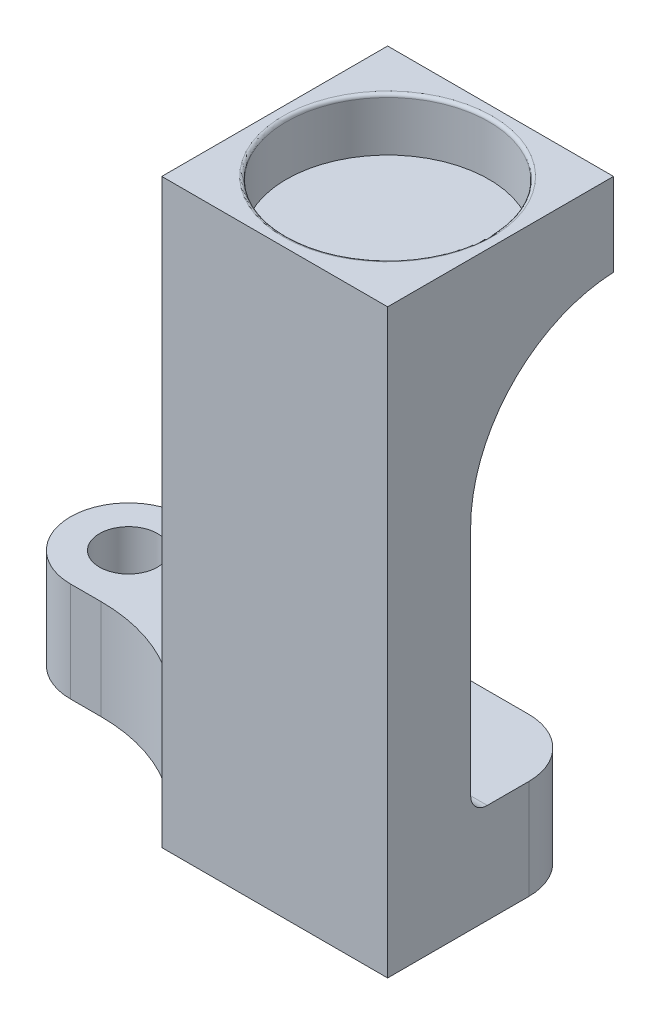
ISO-10303-21;
HEADER;
FILE_DESCRIPTION(('STEP AP214'),'2;1');
FILE_NAME('part.step','',(''),(''),'','','');
FILE_SCHEMA(('AUTOMOTIVE_DESIGN { 1 0 10303 214 1 1 1 1 }'));
ENDSEC;
DATA;
#1=APPLICATION_CONTEXT('core data for automotive mechanical design processes');
#2=APPLICATION_PROTOCOL_DEFINITION('international standard','automotive_design',2000,#1);
#3=PRODUCT_CONTEXT('',#1,'mechanical');
#4=PRODUCT('Part','Part','',(#3));
#5=PRODUCT_RELATED_PRODUCT_CATEGORY('part','',(#4));
#6=PRODUCT_DEFINITION_FORMATION('','',#4);
#7=PRODUCT_DEFINITION_CONTEXT('part definition',#1,'design');
#8=PRODUCT_DEFINITION('design','',#6,#7);
#9=PRODUCT_DEFINITION_SHAPE('','',#8);
#10=(LENGTH_UNIT() NAMED_UNIT(*) SI_UNIT(.MILLI.,.METRE.));
#11=(NAMED_UNIT(*) PLANE_ANGLE_UNIT() SI_UNIT($,.RADIAN.));
#12=(NAMED_UNIT(*) SI_UNIT($,.STERADIAN.) SOLID_ANGLE_UNIT());
#13=UNCERTAINTY_MEASURE_WITH_UNIT(LENGTH_MEASURE(1.E-05),#10,'distance_accuracy_value','');
#14=(GEOMETRIC_REPRESENTATION_CONTEXT(3) GLOBAL_UNCERTAINTY_ASSIGNED_CONTEXT((#13)) GLOBAL_UNIT_ASSIGNED_CONTEXT((#10,
#11,#12)) REPRESENTATION_CONTEXT('',''));
#15=CARTESIAN_POINT('',(0.,0.,0.));
#16=DIRECTION('',(0.,0.,1.));
#17=DIRECTION('',(1.,0.,0.));
#18=AXIS2_PLACEMENT_3D('',#15,#16,#17);
#19=CARTESIAN_POINT('',(-6.8,-30.,1.8));
#20=DIRECTION('',(0.,0.,1.));
#21=DIRECTION('',(1.,0.,0.));
#22=AXIS2_PLACEMENT_3D('',#19,#20,#21);
#23=PLANE('',#22);
#24=DIRECTION('',(0.,1.,0.));
#25=VECTOR('',#24,1.);
#26=CARTESIAN_POINT('',(6.8,-30.,1.8));
#27=LINE('',#26,#25);
#28=CARTESIAN_POINT('',(6.8,-23.,1.8));
#29=VERTEX_POINT('',#28);
#30=CARTESIAN_POINT('',(6.8,-8.99110671719561,1.8));
#31=VERTEX_POINT('',#30);
#32=EDGE_CURVE('E162',#29,#31,#27,.T.);
#33=ORIENTED_EDGE('',*,*,#32,.F.);
#34=DIRECTION('',(1.,0.,0.));
#35=VECTOR('',#34,1.);
#36=CARTESIAN_POINT('',(-6.79999999999999,-23.,1.8));
#37=LINE('',#36,#35);
#38=CARTESIAN_POINT('',(-6.8,-23.,1.8));
#39=VERTEX_POINT('',#38);
#40=EDGE_CURVE('E242',#29,#39,#37,.F.);
#41=ORIENTED_EDGE('',*,*,#40,.T.);
#42=DIRECTION('',(0.,1.,0.));
#43=VECTOR('',#42,1.);
#44=CARTESIAN_POINT('',(-6.8,-30.,1.8));
#45=LINE('',#44,#43);
#46=CARTESIAN_POINT('',(-6.8,-8.99110671719561,1.8));
#47=VERTEX_POINT('',#46);
#48=EDGE_CURVE('E164',#39,#47,#45,.T.);
#49=ORIENTED_EDGE('',*,*,#48,.T.);
#50=DIRECTION('',(1.,0.,0.));
#51=VECTOR('',#50,1.);
#52=CARTESIAN_POINT('',(-6.8,-8.99110671719561,1.8));
#53=LINE('',#52,#51);
#54=EDGE_CURVE('E194',#47,#31,#53,.T.);
#55=ORIENTED_EDGE('',*,*,#54,.T.);
#56=EDGE_LOOP('',(#33,#41,#49,#55));
#57=FACE_BOUND('',#56,.T.);
#58=ADVANCED_FACE('F39',(#57),#23,.F.);
#59=CARTESIAN_POINT('',(6.8,5.,-6.8));
#60=DIRECTION('',(-1.,0.,0.));
#61=DIRECTION('',(0.,0.,1.));
#62=AXIS2_PLACEMENT_3D('',#59,#60,#61);
#63=PLANE('',#62);
#64=DIRECTION('',(0.,0.,1.));
#65=VECTOR('',#64,1.);
#66=CARTESIAN_POINT('',(6.8,-30.,6.8));
#67=LINE('',#66,#65);
#68=CARTESIAN_POINT('',(6.8,-30.,-1.7));
#69=VERTEX_POINT('',#68);
#70=CARTESIAN_POINT('',(6.8,-30.,6.8));
#71=VERTEX_POINT('',#70);
#72=EDGE_CURVE('E135',#69,#71,#67,.T.);
#73=ORIENTED_EDGE('',*,*,#72,.F.);
#74=DIRECTION('',(0.,-1.,0.));
#75=VECTOR('',#74,1.);
#76=CARTESIAN_POINT('',(6.8,5.,-1.7));
#77=LINE('',#76,#75);
#78=CARTESIAN_POINT('',(6.8,-24.,-1.7));
#79=VERTEX_POINT('',#78);
#80=EDGE_CURVE('E229',#69,#79,#77,.F.);
#81=ORIENTED_EDGE('',*,*,#80,.T.);
#82=DIRECTION('',(0.,0.,1.));
#83=VECTOR('',#82,1.);
#84=CARTESIAN_POINT('',(6.8,-24.,-5.2));
#85=LINE('',#84,#83);
#86=CARTESIAN_POINT('',(6.8,-24.,0.799999999999997));
#87=VERTEX_POINT('',#86);
#88=EDGE_CURVE('E145',#79,#87,#85,.T.);
#89=ORIENTED_EDGE('',*,*,#88,.T.);
#90=CARTESIAN_POINT('',(6.8,-23.,0.799999999999997));
#91=DIRECTION('',(-1.,0.,0.));
#92=DIRECTION('',(0.,0.,1.));
#93=AXIS2_PLACEMENT_3D('',#90,#91,#92);
#94=CIRCLE('',#93,1.);
#95=EDGE_CURVE('E11',#87,#29,#94,.T.);
#96=ORIENTED_EDGE('',*,*,#95,.T.);
#97=ORIENTED_EDGE('',*,*,#32,.T.);
#98=CARTESIAN_POINT('',(6.8,-8.99110671719561,-7.2));
#99=DIRECTION('',(-1.,0.,0.));
#100=DIRECTION('',(0.,0.,1.));
#101=AXIS2_PLACEMENT_3D('',#98,#99,#100);
#102=CIRCLE('',#101,9.);
#103=CARTESIAN_POINT('',(6.8,0.,-6.8));
#104=VERTEX_POINT('',#103);
#105=EDGE_CURVE('E197',#31,#104,#102,.T.);
#106=ORIENTED_EDGE('',*,*,#105,.T.);
#107=DIRECTION('',(0.,-1.,0.));
#108=VECTOR('',#107,1.);
#109=CARTESIAN_POINT('',(6.8,5.,-6.8));
#110=LINE('',#109,#108);
#111=CARTESIAN_POINT('',(6.8,5.,-6.8));
#112=VERTEX_POINT('',#111);
#113=EDGE_CURVE('E185',#112,#104,#110,.T.);
#114=ORIENTED_EDGE('',*,*,#113,.F.);
#115=DIRECTION('',(0.,0.,-1.));
#116=VECTOR('',#115,1.);
#117=CARTESIAN_POINT('',(6.8,5.,-6.8));
#118=LINE('',#117,#116);
#119=CARTESIAN_POINT('',(6.8,5.,6.8));
#120=VERTEX_POINT('',#119);
#121=EDGE_CURVE('E153',#120,#112,#118,.T.);
#122=ORIENTED_EDGE('',*,*,#121,.F.);
#123=DIRECTION('',(0.,-1.,0.));
#124=VECTOR('',#123,1.);
#125=CARTESIAN_POINT('',(6.8,5.,6.8));
#126=LINE('',#125,#124);
#127=EDGE_CURVE('E149',#120,#71,#126,.T.);
#128=ORIENTED_EDGE('',*,*,#127,.T.);
#129=EDGE_LOOP('',(#73,#81,#89,#96,#97,#106,#114,#122,#128));
#130=FACE_BOUND('',#129,.T.);
#131=ADVANCED_FACE('F150',(#130),#63,.F.);
#132=CARTESIAN_POINT('',(-6.8,5.,-6.8));
#133=DIRECTION('',(0.,0.,1.));
#134=DIRECTION('',(1.,0.,0.));
#135=AXIS2_PLACEMENT_3D('',#132,#133,#134);
#136=PLANE('',#135);
#137=DIRECTION('',(-1.,0.,0.));
#138=VECTOR('',#137,1.);
#139=CARTESIAN_POINT('',(-6.8,0.,-6.8));
#140=LINE('',#139,#138);
#141=CARTESIAN_POINT('',(-6.8,0.,-6.8));
#142=VERTEX_POINT('',#141);
#143=EDGE_CURVE('E172',#104,#142,#140,.T.);
#144=ORIENTED_EDGE('',*,*,#143,.T.);
#145=DIRECTION('',(0.,-1.,0.));
#146=VECTOR('',#145,1.);
#147=CARTESIAN_POINT('',(-6.8,5.,-6.8));
#148=LINE('',#147,#146);
#149=CARTESIAN_POINT('',(-6.8,5.,-6.8));
#150=VERTEX_POINT('',#149);
#151=EDGE_CURVE('E182',#150,#142,#148,.T.);
#152=ORIENTED_EDGE('',*,*,#151,.F.);
#153=DIRECTION('',(-1.,0.,0.));
#154=VECTOR('',#153,1.);
#155=CARTESIAN_POINT('',(-6.8,5.,-6.8));
#156=LINE('',#155,#154);
#157=EDGE_CURVE('E174',#112,#150,#156,.T.);
#158=ORIENTED_EDGE('',*,*,#157,.F.);
#159=ORIENTED_EDGE('',*,*,#113,.T.);
#160=EDGE_LOOP('',(#144,#152,#158,#159));
#161=FACE_BOUND('',#160,.T.);
#162=ADVANCED_FACE('F276',(#161),#136,.F.);
#163=CARTESIAN_POINT('',(-6.8,5.,-6.8));
#164=DIRECTION('',(1.,0.,0.));
#165=DIRECTION('',(0.,0.,-1.));
#166=AXIS2_PLACEMENT_3D('',#163,#164,#165);
#167=PLANE('',#166);
#168=ORIENTED_EDGE('',*,*,#48,.F.);
#169=DIRECTION('',(0.,0.,1.));
#170=VECTOR('',#169,1.);
#171=CARTESIAN_POINT('',(-6.8,-23.,6.8));
#172=LINE('',#171,#170);
#173=CARTESIAN_POINT('',(-6.8,-23.,6.8));
#174=VERTEX_POINT('',#173);
#175=EDGE_CURVE('E231',#39,#174,#172,.T.);
#176=ORIENTED_EDGE('',*,*,#175,.T.);
#177=DIRECTION('',(0.,-1.,0.));
#178=VECTOR('',#177,1.);
#179=CARTESIAN_POINT('',(-6.8,5.,6.8));
#180=LINE('',#179,#178);
#181=CARTESIAN_POINT('',(-6.8,5.,6.8));
#182=VERTEX_POINT('',#181);
#183=EDGE_CURVE('E180',#182,#174,#180,.T.);
#184=ORIENTED_EDGE('',*,*,#183,.F.);
#185=DIRECTION('',(0.,0.,1.));
#186=VECTOR('',#185,1.);
#187=CARTESIAN_POINT('',(-6.8,5.,-6.8));
#188=LINE('',#187,#186);
#189=EDGE_CURVE('E176',#150,#182,#188,.T.);
#190=ORIENTED_EDGE('',*,*,#189,.F.);
#191=ORIENTED_EDGE('',*,*,#151,.T.);
#192=CARTESIAN_POINT('',(-6.8,-8.99110671719561,-7.2));
#193=DIRECTION('',(1.,0.,0.));
#194=DIRECTION('',(0.,0.,-1.));
#195=AXIS2_PLACEMENT_3D('',#192,#193,#194);
#196=CIRCLE('',#195,9.);
#197=EDGE_CURVE('E199',#142,#47,#196,.T.);
#198=ORIENTED_EDGE('',*,*,#197,.T.);
#199=EDGE_LOOP('',(#168,#176,#184,#190,#191,#198));
#200=FACE_BOUND('',#199,.T.);
#201=ADVANCED_FACE('F295',(#200),#167,.F.);
#202=CARTESIAN_POINT('',(-6.8,5.,6.8));
#203=DIRECTION('',(0.,0.,-1.));
#204=DIRECTION('',(-1.,0.,0.));
#205=AXIS2_PLACEMENT_3D('',#202,#203,#204);
#206=PLANE('',#205);
#207=ORIENTED_EDGE('',*,*,#183,.T.);
#208=CARTESIAN_POINT('',(-6.8,-30.,6.8));
#209=VERTEX_POINT('',#208);
#210=EDGE_CURVE('E156',#174,#209,#180,.T.);
#211=ORIENTED_EDGE('',*,*,#210,.T.);
#212=DIRECTION('',(-1.,0.,0.));
#213=VECTOR('',#212,1.);
#214=CARTESIAN_POINT('',(-6.8,-30.,6.8));
#215=LINE('',#214,#213);
#216=EDGE_CURVE('E140',#71,#209,#215,.T.);
#217=ORIENTED_EDGE('',*,*,#216,.F.);
#218=ORIENTED_EDGE('',*,*,#127,.F.);
#219=DIRECTION('',(1.,0.,0.));
#220=VECTOR('',#219,1.);
#221=CARTESIAN_POINT('',(-6.8,5.,6.8));
#222=LINE('',#221,#220);
#223=EDGE_CURVE('E157',#182,#120,#222,.T.);
#224=ORIENTED_EDGE('',*,*,#223,.F.);
#225=EDGE_LOOP('',(#207,#211,#217,#218,#224));
#226=FACE_BOUND('',#225,.T.);
#227=ADVANCED_FACE('F160',(#226),#206,.F.);
#228=CARTESIAN_POINT('',(0.,5.,0.));
#229=DIRECTION('',(0.,1.,0.));
#230=DIRECTION('',(0.,0.,1.));
#231=AXIS2_PLACEMENT_3D('',#228,#229,#230);
#232=PLANE('',#231);
#233=CARTESIAN_POINT('',(0.,5.,0.));
#234=DIRECTION('',(0.,1.,0.));
#235=DIRECTION('',(0.,0.,1.));
#236=AXIS2_PLACEMENT_3D('',#233,#234,#235);
#237=CIRCLE('',#236,6.3);
#238=CARTESIAN_POINT('',(0.,5.,6.3));
#239=VERTEX_POINT('',#238);
#240=EDGE_CURVE('E191',#239,#239,#237,.F.);
#241=ORIENTED_EDGE('',*,*,#240,.T.);
#242=EDGE_LOOP('',(#241));
#243=FACE_BOUND('',#242,.T.);
#244=ORIENTED_EDGE('',*,*,#121,.T.);
#245=ORIENTED_EDGE('',*,*,#157,.T.);
#246=ORIENTED_EDGE('',*,*,#189,.T.);
#247=ORIENTED_EDGE('',*,*,#223,.T.);
#248=EDGE_LOOP('',(#244,#245,#246,#247));
#249=FACE_BOUND('',#248,.T.);
#250=ADVANCED_FACE('F288',(#243,#249),#232,.T.);
#251=CARTESIAN_POINT('',(0.,1.8,0.));
#252=DIRECTION('',(0.,1.,0.));
#253=DIRECTION('',(0.,0.,1.));
#254=AXIS2_PLACEMENT_3D('',#251,#252,#253);
#255=CYLINDRICAL_SURFACE('',#254,6.1);
#256=CARTESIAN_POINT('',(0.,4.8,0.));
#257=DIRECTION('',(0.,1.,0.));
#258=DIRECTION('',(0.,0.,1.));
#259=AXIS2_PLACEMENT_3D('',#256,#257,#258);
#260=CIRCLE('',#259,6.1);
#261=CARTESIAN_POINT('',(0.,4.8,6.1));
#262=VERTEX_POINT('',#261);
#263=EDGE_CURVE('E188',#262,#262,#260,.T.);
#264=ORIENTED_EDGE('',*,*,#263,.T.);
#265=EDGE_LOOP('',(#264));
#266=FACE_BOUND('',#265,.T.);
#267=CARTESIAN_POINT('',(0.,1.8,0.));
#268=DIRECTION('',(0.,1.,0.));
#269=DIRECTION('',(0.,0.,1.));
#270=AXIS2_PLACEMENT_3D('',#267,#268,#269);
#271=CIRCLE('',#270,6.1);
#272=CARTESIAN_POINT('',(0.,1.8,6.1));
#273=VERTEX_POINT('',#272);
#274=EDGE_CURVE('E169',#273,#273,#271,.T.);
#275=ORIENTED_EDGE('',*,*,#274,.F.);
#276=EDGE_LOOP('',(#275));
#277=FACE_BOUND('',#276,.T.);
#278=ADVANCED_FACE('F284',(#266,#277),#255,.F.);
#279=CARTESIAN_POINT('',(0.,1.8,0.));
#280=DIRECTION('',(0.,1.,0.));
#281=DIRECTION('',(0.,0.,1.));
#282=AXIS2_PLACEMENT_3D('',#279,#280,#281);
#283=PLANE('',#282);
#284=ORIENTED_EDGE('',*,*,#274,.T.);
#285=EDGE_LOOP('',(#284));
#286=FACE_BOUND('',#285,.T.);
#287=ADVANCED_FACE('F281',(#286),#283,.T.);
#288=CARTESIAN_POINT('',(0.,-30.,0.));
#289=DIRECTION('',(0.,-1.,0.));
#290=DIRECTION('',(0.,0.,-1.));
#291=AXIS2_PLACEMENT_3D('',#288,#289,#290);
#292=PLANE('',#291);
#293=CARTESIAN_POINT('',(-10.3,-30.,-1.7));
#294=DIRECTION('',(0.,1.,0.));
#295=DIRECTION('',(0.,0.,1.));
#296=AXIS2_PLACEMENT_3D('',#293,#294,#295);
#297=CIRCLE('',#296,1.75);
#298=CARTESIAN_POINT('',(-10.3,-30.,0.0499999999999956));
#299=VERTEX_POINT('',#298);
#300=EDGE_CURVE('E341',#299,#299,#297,.T.);
#301=ORIENTED_EDGE('',*,*,#300,.T.);
#302=EDGE_LOOP('',(#301));
#303=FACE_BOUND('',#302,.T.);
#304=CARTESIAN_POINT('',(-17.3,-30.,-1.7));
#305=DIRECTION('',(0.,1.,0.));
#306=DIRECTION('',(0.,0.,1.));
#307=AXIS2_PLACEMENT_3D('',#304,#305,#306);
#308=CIRCLE('',#307,1.75);
#309=CARTESIAN_POINT('',(-17.3,-30.,0.0499999999999964));
#310=VERTEX_POINT('',#309);
#311=EDGE_CURVE('E235',#310,#310,#308,.T.);
#312=ORIENTED_EDGE('',*,*,#311,.T.);
#313=EDGE_LOOP('',(#312));
#314=FACE_BOUND('',#313,.T.);
#315=DIRECTION('',(-1.,0.,0.));
#316=VECTOR('',#315,1.);
#317=CARTESIAN_POINT('',(6.8,-30.,1.8));
#318=LINE('',#317,#316);
#319=CARTESIAN_POINT('',(-15.4602540378444,-30.,1.8));
#320=VERTEX_POINT('',#319);
#321=CARTESIAN_POINT('',(-17.3,-30.,1.8));
#322=VERTEX_POINT('',#321);
#323=EDGE_CURVE('E337',#320,#322,#318,.T.);
#324=ORIENTED_EDGE('',*,*,#323,.T.);
#325=CARTESIAN_POINT('',(-17.3,-30.,-1.7));
#326=DIRECTION('',(0.,-1.,0.));
#327=DIRECTION('',(0.,0.,-1.));
#328=AXIS2_PLACEMENT_3D('',#325,#326,#327);
#329=CIRCLE('',#328,3.5);
#330=CARTESIAN_POINT('',(-20.8,-30.,-1.7));
#331=VERTEX_POINT('',#330);
#332=EDGE_CURVE('E222',#322,#331,#329,.T.);
#333=ORIENTED_EDGE('',*,*,#332,.T.);
#334=CARTESIAN_POINT('',(-17.3,-30.,-1.7));
#335=DIRECTION('',(0.,-1.,0.));
#336=DIRECTION('',(0.,0.,-1.));
#337=AXIS2_PLACEMENT_3D('',#334,#335,#336);
#338=CIRCLE('',#337,3.5);
#339=CARTESIAN_POINT('',(-17.3,-30.,-5.2));
#340=VERTEX_POINT('',#339);
#341=EDGE_CURVE('E220',#331,#340,#338,.T.);
#342=ORIENTED_EDGE('',*,*,#341,.T.);
#343=DIRECTION('',(-1.,0.,0.));
#344=VECTOR('',#343,1.);
#345=CARTESIAN_POINT('',(6.8,-30.,-5.2));
#346=LINE('',#345,#344);
#347=CARTESIAN_POINT('',(3.3,-30.,-5.2));
#348=VERTEX_POINT('',#347);
#349=EDGE_CURVE('E343',#348,#340,#346,.T.);
#350=ORIENTED_EDGE('',*,*,#349,.F.);
#351=CARTESIAN_POINT('',(3.3,-30.,-1.7));
#352=DIRECTION('',(0.,-1.,0.));
#353=DIRECTION('',(0.,0.,-1.));
#354=AXIS2_PLACEMENT_3D('',#351,#352,#353);
#355=CIRCLE('',#354,3.5);
#356=EDGE_CURVE('E143',#348,#69,#355,.T.);
#357=ORIENTED_EDGE('',*,*,#356,.T.);
#358=ORIENTED_EDGE('',*,*,#72,.T.);
#359=ORIENTED_EDGE('',*,*,#216,.T.);
#360=CARTESIAN_POINT('',(-15.4602540378444,-30.,11.8));
#361=DIRECTION('',(0.,-1.,0.));
#362=DIRECTION('',(0.,0.,-1.));
#363=AXIS2_PLACEMENT_3D('',#360,#361,#362);
#364=CIRCLE('',#363,10.);
#365=EDGE_CURVE('E208',#209,#320,#364,.F.);
#366=ORIENTED_EDGE('',*,*,#365,.T.);
#367=EDGE_LOOP('',(#324,#333,#342,#350,#357,#358,#359,#366));
#368=FACE_BOUND('',#367,.T.);
#369=ADVANCED_FACE('F138',(#303,#314,#368),#292,.T.);
#370=CARTESIAN_POINT('',(0.,4.8,0.));
#371=DIRECTION('',(0.,1.,0.));
#372=DIRECTION('',(0.,0.,1.));
#373=AXIS2_PLACEMENT_3D('',#370,#371,#372);
#374=TOROIDAL_SURFACE('',#373,6.3,0.2);
#375=ORIENTED_EDGE('',*,*,#240,.F.);
#376=EDGE_LOOP('',(#375));
#377=FACE_BOUND('',#376,.T.);
#378=ORIENTED_EDGE('',*,*,#263,.F.);
#379=EDGE_LOOP('',(#378));
#380=FACE_BOUND('',#379,.T.);
#381=ADVANCED_FACE('F302',(#377,#380),#374,.T.);
#382=CARTESIAN_POINT('',(0.,-8.99110671719561,-7.2));
#383=DIRECTION('',(1.,0.,0.));
#384=DIRECTION('',(0.,0.,-1.));
#385=AXIS2_PLACEMENT_3D('',#382,#383,#384);
#386=CYLINDRICAL_SURFACE('',#385,9.);
#387=ORIENTED_EDGE('',*,*,#197,.F.);
#388=ORIENTED_EDGE('',*,*,#143,.F.);
#389=ORIENTED_EDGE('',*,*,#105,.F.);
#390=ORIENTED_EDGE('',*,*,#54,.F.);
#391=EDGE_LOOP('',(#387,#388,#389,#390));
#392=FACE_BOUND('',#391,.T.);
#393=ADVANCED_FACE('F304',(#392),#386,.F.);
#394=CARTESIAN_POINT('',(0.,0.,1.8));
#395=DIRECTION('',(0.,0.,1.));
#396=DIRECTION('',(1.,0.,0.));
#397=AXIS2_PLACEMENT_3D('',#394,#395,#396);
#398=PLANE('',#397);
#399=DIRECTION('',(1.,0.,0.));
#400=VECTOR('',#399,1.);
#401=CARTESIAN_POINT('',(6.8,-24.,1.8));
#402=LINE('',#401,#400);
#403=CARTESIAN_POINT('',(-17.3,-24.,1.8));
#404=VERTEX_POINT('',#403);
#405=CARTESIAN_POINT('',(-15.4602540378444,-24.,1.8));
#406=VERTEX_POINT('',#405);
#407=EDGE_CURVE('E340',#404,#406,#402,.T.);
#408=ORIENTED_EDGE('',*,*,#407,.F.);
#409=DIRECTION('',(0.,1.,0.));
#410=VECTOR('',#409,1.);
#411=CARTESIAN_POINT('',(-17.3,-30.,1.8));
#412=LINE('',#411,#410);
#413=EDGE_CURVE('E216',#404,#322,#412,.F.);
#414=ORIENTED_EDGE('',*,*,#413,.T.);
#415=ORIENTED_EDGE('',*,*,#323,.F.);
#416=DIRECTION('',(0.,-1.,0.));
#417=VECTOR('',#416,1.);
#418=CARTESIAN_POINT('',(-15.4602540378444,-24.,1.8));
#419=LINE('',#418,#417);
#420=EDGE_CURVE('E202',#320,#406,#419,.F.);
#421=ORIENTED_EDGE('',*,*,#420,.T.);
#422=EDGE_LOOP('',(#408,#414,#415,#421));
#423=FACE_BOUND('',#422,.T.);
#424=ADVANCED_FACE('F307',(#423),#398,.T.);
#425=CARTESIAN_POINT('',(6.8,-24.,-5.2));
#426=DIRECTION('',(0.,-1.,0.));
#427=DIRECTION('',(0.,0.,-1.));
#428=AXIS2_PLACEMENT_3D('',#425,#426,#427);
#429=PLANE('',#428);
#430=CARTESIAN_POINT('',(-10.3,-24.,-1.7));
#431=DIRECTION('',(0.,1.,0.));
#432=DIRECTION('',(0.,0.,1.));
#433=AXIS2_PLACEMENT_3D('',#430,#431,#432);
#434=CIRCLE('',#433,1.75);
#435=CARTESIAN_POINT('',(-10.3,-24.,0.0499999999999956));
#436=VERTEX_POINT('',#435);
#437=EDGE_CURVE('E346',#436,#436,#434,.T.);
#438=ORIENTED_EDGE('',*,*,#437,.F.);
#439=EDGE_LOOP('',(#438));
#440=FACE_BOUND('',#439,.T.);
#441=CARTESIAN_POINT('',(-17.3,-24.,-1.7));
#442=DIRECTION('',(0.,1.,0.));
#443=DIRECTION('',(0.,0.,1.));
#444=AXIS2_PLACEMENT_3D('',#441,#442,#443);
#445=CIRCLE('',#444,1.75);
#446=CARTESIAN_POINT('',(-17.3,-24.,0.0499999999999964));
#447=VERTEX_POINT('',#446);
#448=EDGE_CURVE('E361',#447,#447,#445,.T.);
#449=ORIENTED_EDGE('',*,*,#448,.F.);
#450=EDGE_LOOP('',(#449));
#451=FACE_BOUND('',#450,.T.);
#452=CARTESIAN_POINT('',(-15.4602540378444,-24.,11.8));
#453=DIRECTION('',(0.,-1.,0.));
#454=DIRECTION('',(0.,0.,-1.));
#455=AXIS2_PLACEMENT_3D('',#452,#453,#454);
#456=CIRCLE('',#455,10.);
#457=CARTESIAN_POINT('',(-7.8,-24.,5.37189700800548));
#458=VERTEX_POINT('',#457);
#459=EDGE_CURVE('E205',#406,#458,#456,.T.);
#460=ORIENTED_EDGE('',*,*,#459,.T.);
#461=DIRECTION('',(0.,0.,1.));
#462=VECTOR('',#461,1.);
#463=CARTESIAN_POINT('',(-7.8,-24.,1.8));
#464=LINE('',#463,#462);
#465=CARTESIAN_POINT('',(-7.8,-24.,0.799999999999997));
#466=VERTEX_POINT('',#465);
#467=EDGE_CURVE('E240',#458,#466,#464,.F.);
#468=ORIENTED_EDGE('',*,*,#467,.T.);
#469=DIRECTION('',(1.,0.,0.));
#470=VECTOR('',#469,1.);
#471=CARTESIAN_POINT('',(6.8,-24.,0.799999999999997));
#472=LINE('',#471,#470);
#473=EDGE_CURVE('E238',#466,#87,#472,.T.);
#474=ORIENTED_EDGE('',*,*,#473,.T.);
#475=ORIENTED_EDGE('',*,*,#88,.F.);
#476=CARTESIAN_POINT('',(3.3,-24.,-1.7));
#477=DIRECTION('',(0.,-1.,0.));
#478=DIRECTION('',(0.,0.,-1.));
#479=AXIS2_PLACEMENT_3D('',#476,#477,#478);
#480=CIRCLE('',#479,3.5);
#481=CARTESIAN_POINT('',(3.3,-24.,-5.2));
#482=VERTEX_POINT('',#481);
#483=EDGE_CURVE('E210',#79,#482,#480,.F.);
#484=ORIENTED_EDGE('',*,*,#483,.T.);
#485=DIRECTION('',(1.,0.,0.));
#486=VECTOR('',#485,1.);
#487=CARTESIAN_POINT('',(6.8,-24.,-5.2));
#488=LINE('',#487,#486);
#489=CARTESIAN_POINT('',(-17.3,-24.,-5.2));
#490=VERTEX_POINT('',#489);
#491=EDGE_CURVE('E349',#490,#482,#488,.T.);
#492=ORIENTED_EDGE('',*,*,#491,.F.);
#493=CARTESIAN_POINT('',(-17.3,-24.,-1.7));
#494=DIRECTION('',(0.,-1.,0.));
#495=DIRECTION('',(0.,0.,-1.));
#496=AXIS2_PLACEMENT_3D('',#493,#494,#495);
#497=CIRCLE('',#496,3.5);
#498=CARTESIAN_POINT('',(-20.8,-24.,-1.7));
#499=VERTEX_POINT('',#498);
#500=EDGE_CURVE('E212',#490,#499,#497,.F.);
#501=ORIENTED_EDGE('',*,*,#500,.T.);
#502=CARTESIAN_POINT('',(-17.3,-24.,-1.7));
#503=DIRECTION('',(0.,-1.,0.));
#504=DIRECTION('',(0.,0.,-1.));
#505=AXIS2_PLACEMENT_3D('',#502,#503,#504);
#506=CIRCLE('',#505,3.5);
#507=EDGE_CURVE('E214',#499,#404,#506,.F.);
#508=ORIENTED_EDGE('',*,*,#507,.T.);
#509=ORIENTED_EDGE('',*,*,#407,.T.);
#510=EDGE_LOOP('',(#460,#468,#474,#475,#484,#492,#501,#508,#509));
#511=FACE_BOUND('',#510,.T.);
#512=ADVANCED_FACE('F313',(#440,#451,#511),#429,.F.);
#513=CARTESIAN_POINT('',(0.,0.,-5.2));
#514=DIRECTION('',(0.,0.,1.));
#515=DIRECTION('',(1.,0.,0.));
#516=AXIS2_PLACEMENT_3D('',#513,#514,#515);
#517=PLANE('',#516);
#518=ORIENTED_EDGE('',*,*,#349,.T.);
#519=DIRECTION('',(0.,1.,0.));
#520=VECTOR('',#519,1.);
#521=CARTESIAN_POINT('',(-17.3,0.,-5.2));
#522=LINE('',#521,#520);
#523=EDGE_CURVE('E227',#340,#490,#522,.T.);
#524=ORIENTED_EDGE('',*,*,#523,.T.);
#525=ORIENTED_EDGE('',*,*,#491,.T.);
#526=DIRECTION('',(0.,-1.,0.));
#527=VECTOR('',#526,1.);
#528=CARTESIAN_POINT('',(3.3,0.,-5.2));
#529=LINE('',#528,#527);
#530=EDGE_CURVE('E224',#482,#348,#529,.T.);
#531=ORIENTED_EDGE('',*,*,#530,.T.);
#532=EDGE_LOOP('',(#518,#524,#525,#531));
#533=FACE_BOUND('',#532,.T.);
#534=ADVANCED_FACE('F371',(#533),#517,.F.);
#535=CARTESIAN_POINT('',(-17.3,-30.,-1.7));
#536=DIRECTION('',(0.,1.,0.));
#537=DIRECTION('',(0.,0.,1.));
#538=AXIS2_PLACEMENT_3D('',#535,#536,#537);
#539=CYLINDRICAL_SURFACE('',#538,1.75);
#540=ORIENTED_EDGE('',*,*,#311,.F.);
#541=EDGE_LOOP('',(#540));
#542=FACE_BOUND('',#541,.T.);
#543=ORIENTED_EDGE('',*,*,#448,.T.);
#544=EDGE_LOOP('',(#543));
#545=FACE_BOUND('',#544,.T.);
#546=ADVANCED_FACE('F380',(#542,#545),#539,.F.);
#547=CARTESIAN_POINT('',(-10.3,-30.,-1.7));
#548=DIRECTION('',(0.,1.,0.));
#549=DIRECTION('',(0.,0.,1.));
#550=AXIS2_PLACEMENT_3D('',#547,#548,#549);
#551=CYLINDRICAL_SURFACE('',#550,1.75);
#552=ORIENTED_EDGE('',*,*,#300,.F.);
#553=EDGE_LOOP('',(#552));
#554=FACE_BOUND('',#553,.T.);
#555=ORIENTED_EDGE('',*,*,#437,.T.);
#556=EDGE_LOOP('',(#555));
#557=FACE_BOUND('',#556,.T.);
#558=ADVANCED_FACE('F367',(#554,#557),#551,.F.);
#559=CARTESIAN_POINT('',(-15.4602540378444,5.,11.8));
#560=DIRECTION('',(0.,1.,0.));
#561=DIRECTION('',(0.,0.,1.));
#562=AXIS2_PLACEMENT_3D('',#559,#560,#561);
#563=CYLINDRICAL_SURFACE('',#562,10.);
#564=ORIENTED_EDGE('',*,*,#365,.F.);
#565=ORIENTED_EDGE('',*,*,#210,.F.);
#566=CARTESIAN_POINT('',(-6.8,-23.,6.8));
#567=CARTESIAN_POINT('',(-6.79996241698524,-23.0306581582051,6.80007270188269));
#568=CARTESIAN_POINT('',(-6.80140781492477,-23.0612082024637,6.79756124935341));
#569=CARTESIAN_POINT('',(-6.80691017471412,-23.1210097129236,6.78804540979888));
#570=CARTESIAN_POINT('',(-6.81093678090053,-23.1502721020879,6.78109324996321));
#571=CARTESIAN_POINT('',(-6.82258570702137,-23.2144541410767,6.76106742795712));
#572=CARTESIAN_POINT('',(-6.83086545598411,-23.2488993467378,6.74688091863336));
#573=CARTESIAN_POINT('',(-6.85022190036032,-23.3148153940677,6.71396855977854));
#574=CARTESIAN_POINT('',(-6.86131228139222,-23.346270615378,6.69522051746347));
#575=CARTESIAN_POINT('',(-6.89283907060473,-23.4239361955104,6.64240243691978));
#576=CARTESIAN_POINT('',(-6.91490785481768,-23.4677767613146,6.60585714690479));
#577=CARTESIAN_POINT('',(-6.96267283137028,-23.5487229778996,6.52807262198034));
#578=CARTESIAN_POINT('',(-6.9883770414163,-23.5858133165157,6.48682305209519));
#579=CARTESIAN_POINT('',(-7.0395407937259,-23.6505448132061,6.40615006614556));
#580=CARTESIAN_POINT('',(-7.06472255886324,-23.6787750196376,6.36701642086822));
#581=CARTESIAN_POINT('',(-7.11686935848912,-23.7312315451114,6.28726816802196));
#582=CARTESIAN_POINT('',(-7.14383569040264,-23.7554549052909,6.24665249282113));
#583=CARTESIAN_POINT('',(-7.22714421232705,-23.8227739388048,6.123229834487));
#584=CARTESIAN_POINT('',(-7.28581927819104,-23.8604263329647,6.03896905435085));
#585=CARTESIAN_POINT('',(-7.38203031953642,-23.9093084065294,5.90543080358483));
#586=CARTESIAN_POINT('',(-7.41795072996429,-23.9249664855892,5.85650693567061));
#587=CARTESIAN_POINT('',(-7.49127757521896,-23.9519550545232,5.75854750294413));
#588=CARTESIAN_POINT('',(-7.52868415327537,-23.9632851261626,5.70951192779746));
#589=CARTESIAN_POINT('',(-7.60445788136716,-23.9814626058682,5.61208940406402));
#590=CARTESIAN_POINT('',(-7.64281306784011,-23.9883501922478,5.56370063238828));
#591=CARTESIAN_POINT('',(-7.72062525737671,-23.9976101747025,5.46738609806947));
#592=CARTESIAN_POINT('',(-7.76008220302768,-23.9999828056079,5.41946031147476));
#593=CARTESIAN_POINT('',(-7.8,-24.,5.37189700800548));
#594=B_SPLINE_CURVE_WITH_KNOTS('',3,(#566,#567,#568,#569,#570,#571,#572,#573,#574,#575,#576,
#577,#578,#579,#580,#581,#582,#583,#584,#585,#586,#587,#588,#589,#590,#591,#592,#593),
.UNSPECIFIED.,.F.,.F.,(4,2,2,2,2,2,2,2,2,2,2,2,2,4),(0.,0.0916631888219591,0.182267692746217,
0.296115090555364,0.410527861693103,0.593082601732315,0.776046421902641,0.939099505080316,
1.10227246269721,1.42912596359242,1.61704972646577,1.8049916446626,1.99120903539115,
2.17741674037437),.UNSPECIFIED.);
#595=EDGE_CURVE('E49',#174,#458,#594,.T.);
#596=ORIENTED_EDGE('',*,*,#595,.T.);
#597=ORIENTED_EDGE('',*,*,#459,.F.);
#598=ORIENTED_EDGE('',*,*,#420,.F.);
#599=EDGE_LOOP('',(#564,#565,#596,#597,#598));
#600=FACE_BOUND('',#599,.T.);
#601=ADVANCED_FACE('F249',(#600),#563,.F.);
#602=CARTESIAN_POINT('',(-17.3,0.,-1.7));
#603=DIRECTION('',(0.,1.,0.));
#604=DIRECTION('',(0.,0.,1.));
#605=AXIS2_PLACEMENT_3D('',#602,#603,#604);
#606=CYLINDRICAL_SURFACE('',#605,3.5);
#607=ORIENTED_EDGE('',*,*,#523,.F.);
#608=ORIENTED_EDGE('',*,*,#341,.F.);
#609=DIRECTION('',(0.,1.,0.));
#610=VECTOR('',#609,1.);
#611=CARTESIAN_POINT('',(-20.8,-30.,-1.7));
#612=LINE('',#611,#610);
#613=EDGE_CURVE('E232',#499,#331,#612,.F.);
#614=ORIENTED_EDGE('',*,*,#613,.F.);
#615=ORIENTED_EDGE('',*,*,#500,.F.);
#616=EDGE_LOOP('',(#607,#608,#614,#615));
#617=FACE_BOUND('',#616,.T.);
#618=ADVANCED_FACE('F263',(#617),#606,.T.);
#619=CARTESIAN_POINT('',(-17.3,-30.,-1.7));
#620=DIRECTION('',(0.,-1.,0.));
#621=DIRECTION('',(0.,0.,-1.));
#622=AXIS2_PLACEMENT_3D('',#619,#620,#621);
#623=CYLINDRICAL_SURFACE('',#622,3.5);
#624=ORIENTED_EDGE('',*,*,#332,.F.);
#625=ORIENTED_EDGE('',*,*,#413,.F.);
#626=ORIENTED_EDGE('',*,*,#507,.F.);
#627=ORIENTED_EDGE('',*,*,#613,.T.);
#628=EDGE_LOOP('',(#624,#625,#626,#627));
#629=FACE_BOUND('',#628,.T.);
#630=ADVANCED_FACE('F261',(#629),#623,.T.);
#631=CARTESIAN_POINT('',(3.3,0.,-1.7));
#632=DIRECTION('',(0.,-1.,0.));
#633=DIRECTION('',(0.,0.,-1.));
#634=AXIS2_PLACEMENT_3D('',#631,#632,#633);
#635=CYLINDRICAL_SURFACE('',#634,3.5);
#636=ORIENTED_EDGE('',*,*,#483,.F.);
#637=ORIENTED_EDGE('',*,*,#80,.F.);
#638=ORIENTED_EDGE('',*,*,#356,.F.);
#639=ORIENTED_EDGE('',*,*,#530,.F.);
#640=EDGE_LOOP('',(#636,#637,#638,#639));
#641=FACE_BOUND('',#640,.T.);
#642=ADVANCED_FACE('F258',(#641),#635,.T.);
#643=CARTESIAN_POINT('',(6.8,-23.,0.799999999999997));
#644=DIRECTION('',(-1.,0.,0.));
#645=DIRECTION('',(0.,0.,1.));
#646=AXIS2_PLACEMENT_3D('',#643,#644,#645);
#647=CYLINDRICAL_SURFACE('',#646,1.);
#648=ORIENTED_EDGE('',*,*,#95,.F.);
#649=ORIENTED_EDGE('',*,*,#473,.F.);
#650=CARTESIAN_POINT('',(-7.8,-23.,0.799999999999997));
#651=DIRECTION('',(-0.707106781186547,0.,0.707106781186548));
#652=DIRECTION('',(-0.707106781186548,0.,-0.707106781186547));
#653=AXIS2_PLACEMENT_3D('',#650,#651,#652);
#654=ELLIPSE('',#653,1.4142135623731,1.);
#655=EDGE_CURVE('E43',#39,#466,#654,.F.);
#656=ORIENTED_EDGE('',*,*,#655,.F.);
#657=ORIENTED_EDGE('',*,*,#40,.F.);
#658=EDGE_LOOP('',(#648,#649,#656,#657));
#659=FACE_BOUND('',#658,.T.);
#660=ADVANCED_FACE('F41',(#659),#647,.F.);
#661=CARTESIAN_POINT('',(-7.8,-23.,-6.8));
#662=DIRECTION('',(0.,0.,-1.));
#663=DIRECTION('',(-1.,0.,0.));
#664=AXIS2_PLACEMENT_3D('',#661,#662,#663);
#665=CYLINDRICAL_SURFACE('',#664,1.);
#666=ORIENTED_EDGE('',*,*,#655,.T.);
#667=ORIENTED_EDGE('',*,*,#467,.F.);
#668=ORIENTED_EDGE('',*,*,#595,.F.);
#669=ORIENTED_EDGE('',*,*,#175,.F.);
#670=EDGE_LOOP('',(#666,#667,#668,#669));
#671=FACE_BOUND('',#670,.T.);
#672=ADVANCED_FACE('F253',(#671),#665,.F.);
#673=CLOSED_SHELL('',(#58,#131,#162,#201,#227,#250,#278,#287,#369,#381,#393,#424,#512,#534,#546,
#558,#601,#618,#630,#642,#660,#672));
#674=MANIFOLD_SOLID_BREP('B2',#673);
#675=ADVANCED_BREP_SHAPE_REPRESENTATION('',(#18,#674),#14);
#676=SHAPE_DEFINITION_REPRESENTATION(#9,#675);
ENDSEC;
END-ISO-10303-21;
